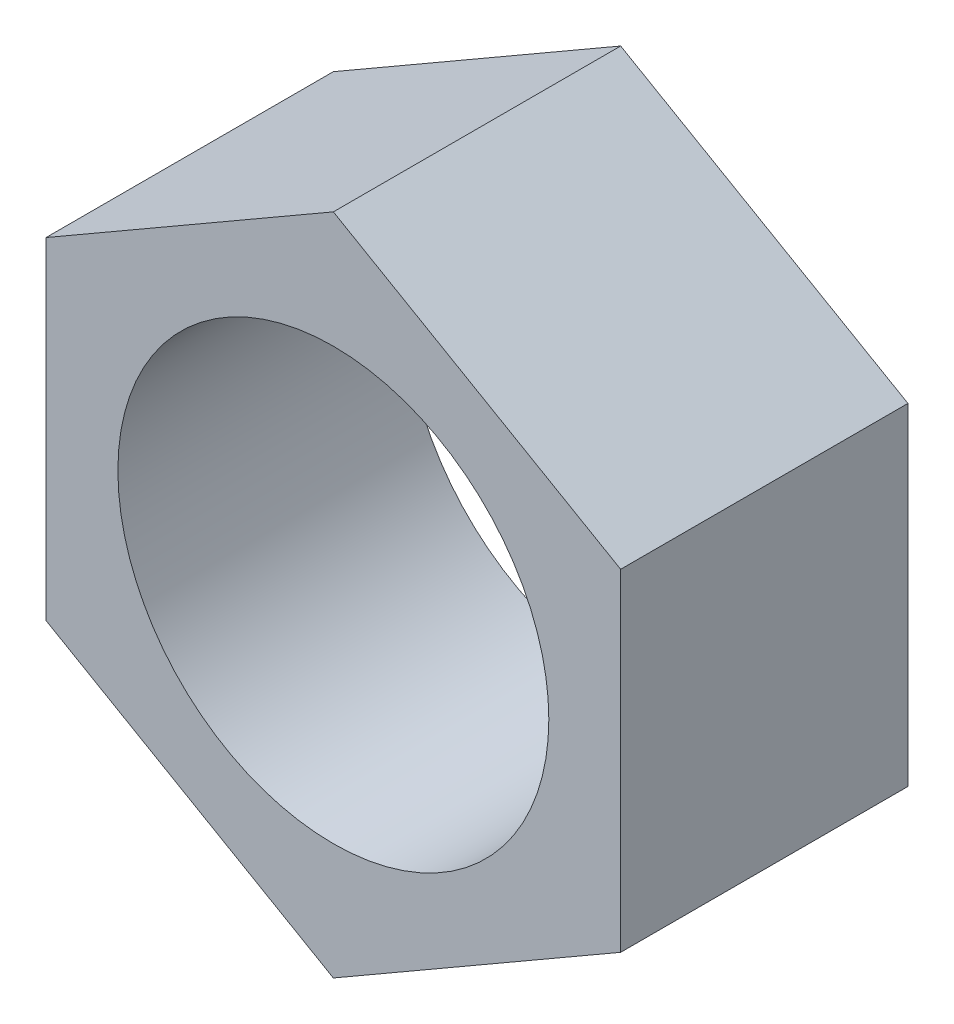
ISO-10303-21;
HEADER;
FILE_DESCRIPTION(('STEP AP214'),'2;1');
FILE_NAME('part.step','',(''),(''),'','','');
FILE_SCHEMA(('AUTOMOTIVE_DESIGN { 1 0 10303 214 1 1 1 1 }'));
ENDSEC;
DATA;
#1=APPLICATION_CONTEXT('core data for automotive mechanical design processes');
#2=APPLICATION_PROTOCOL_DEFINITION('international standard','automotive_design',2000,#1);
#3=PRODUCT_CONTEXT('',#1,'mechanical');
#4=PRODUCT('Part','Part','',(#3));
#5=PRODUCT_RELATED_PRODUCT_CATEGORY('part','',(#4));
#6=PRODUCT_DEFINITION_FORMATION('','',#4);
#7=PRODUCT_DEFINITION_CONTEXT('part definition',#1,'design');
#8=PRODUCT_DEFINITION('design','',#6,#7);
#9=PRODUCT_DEFINITION_SHAPE('','',#8);
#10=(LENGTH_UNIT() NAMED_UNIT(*) SI_UNIT(.MILLI.,.METRE.));
#11=(NAMED_UNIT(*) PLANE_ANGLE_UNIT() SI_UNIT($,.RADIAN.));
#12=(NAMED_UNIT(*) SI_UNIT($,.STERADIAN.) SOLID_ANGLE_UNIT());
#13=UNCERTAINTY_MEASURE_WITH_UNIT(LENGTH_MEASURE(1.E-05),#10,'distance_accuracy_value','');
#14=(GEOMETRIC_REPRESENTATION_CONTEXT(3) GLOBAL_UNCERTAINTY_ASSIGNED_CONTEXT((#13)) GLOBAL_UNIT_ASSIGNED_CONTEXT((#10,
#11,#12)) REPRESENTATION_CONTEXT('',''));
#15=CARTESIAN_POINT('',(0.,0.,0.));
#16=DIRECTION('',(0.,0.,1.));
#17=DIRECTION('',(1.,0.,0.));
#18=AXIS2_PLACEMENT_3D('',#15,#16,#17);
#19=CARTESIAN_POINT('',(9.99999999999999,1.05162021911601E-13,10.));
#20=DIRECTION('',(-1.,0.,0.));
#21=DIRECTION('',(0.,-1.,0.));
#22=AXIS2_PLACEMENT_3D('',#19,#20,#21);
#23=PLANE('',#22);
#24=DIRECTION('',(0.,1.,0.));
#25=VECTOR('',#24,1.);
#26=CARTESIAN_POINT('',(9.99999999999999,1.05162021911601E-13,0.));
#27=LINE('',#26,#25);
#28=CARTESIAN_POINT('',(10.0000000000001,-5.77350269189617,0.));
#29=VERTEX_POINT('',#28);
#30=CARTESIAN_POINT('',(9.99999999999993,5.77350269189638,0.));
#31=VERTEX_POINT('',#30);
#32=EDGE_CURVE('E131',#29,#31,#27,.T.);
#33=ORIENTED_EDGE('',*,*,#32,.T.);
#34=DIRECTION('',(0.,0.,-1.));
#35=VECTOR('',#34,1.);
#36=CARTESIAN_POINT('',(9.99999999999993,5.77350269189638,10.));
#37=LINE('',#36,#35);
#38=CARTESIAN_POINT('',(9.99999999999993,5.77350269189638,10.));
#39=VERTEX_POINT('',#38);
#40=EDGE_CURVE('E11',#39,#31,#37,.T.);
#41=ORIENTED_EDGE('',*,*,#40,.F.);
#42=DIRECTION('',(0.,1.,0.));
#43=VECTOR('',#42,1.);
#44=CARTESIAN_POINT('',(9.99999999999999,1.05162021911601E-13,10.));
#45=LINE('',#44,#43);
#46=CARTESIAN_POINT('',(10.0000000000001,-5.77350269189617,10.));
#47=VERTEX_POINT('',#46);
#48=EDGE_CURVE('E154',#47,#39,#45,.T.);
#49=ORIENTED_EDGE('',*,*,#48,.F.);
#50=DIRECTION('',(0.,0.,-1.));
#51=VECTOR('',#50,1.);
#52=CARTESIAN_POINT('',(10.0000000000001,-5.77350269189617,10.));
#53=LINE('',#52,#51);
#54=EDGE_CURVE('E124',#47,#29,#53,.T.);
#55=ORIENTED_EDGE('',*,*,#54,.T.);
#56=EDGE_LOOP('',(#33,#41,#49,#55));
#57=FACE_BOUND('',#56,.T.);
#58=ADVANCED_FACE('F43',(#57),#23,.F.);
#59=CARTESIAN_POINT('',(4.99999999999997,8.66025403784445,10.));
#60=DIRECTION('',(-0.499999999999995,-0.866025403784442,0.));
#61=DIRECTION('',(0.866025403784442,-0.499999999999995,0.));
#62=AXIS2_PLACEMENT_3D('',#59,#60,#61);
#63=PLANE('',#62);
#64=DIRECTION('',(-0.866025403784442,0.499999999999995,0.));
#65=VECTOR('',#64,1.);
#66=CARTESIAN_POINT('',(4.99999999999997,8.66025403784445,0.));
#67=LINE('',#66,#65);
#68=CARTESIAN_POINT('',(0.,11.5470053837925,0.));
#69=VERTEX_POINT('',#68);
#70=EDGE_CURVE('E134',#31,#69,#67,.T.);
#71=ORIENTED_EDGE('',*,*,#70,.T.);
#72=DIRECTION('',(0.,0.,-1.));
#73=VECTOR('',#72,1.);
#74=CARTESIAN_POINT('',(0.,11.5470053837925,10.));
#75=LINE('',#74,#73);
#76=CARTESIAN_POINT('',(0.,11.5470053837925,10.));
#77=VERTEX_POINT('',#76);
#78=EDGE_CURVE('E52',#77,#69,#75,.T.);
#79=ORIENTED_EDGE('',*,*,#78,.F.);
#80=DIRECTION('',(-0.866025403784442,0.499999999999995,0.));
#81=VECTOR('',#80,1.);
#82=CARTESIAN_POINT('',(4.99999999999997,8.66025403784445,10.));
#83=LINE('',#82,#81);
#84=EDGE_CURVE('E97',#39,#77,#83,.T.);
#85=ORIENTED_EDGE('',*,*,#84,.F.);
#86=ORIENTED_EDGE('',*,*,#40,.T.);
#87=EDGE_LOOP('',(#71,#79,#85,#86));
#88=FACE_BOUND('',#87,.T.);
#89=ADVANCED_FACE('F168',(#88),#63,.F.);
#90=CARTESIAN_POINT('',(-5.00000000000001,8.66025403784438,10.));
#91=DIRECTION('',(0.500000000000001,-0.866025403784438,0.));
#92=DIRECTION('',(0.866025403784438,0.500000000000001,0.));
#93=AXIS2_PLACEMENT_3D('',#90,#91,#92);
#94=PLANE('',#93);
#95=DIRECTION('',(-0.866025403784438,-0.500000000000001,0.));
#96=VECTOR('',#95,1.);
#97=CARTESIAN_POINT('',(-5.00000000000001,8.66025403784438,0.));
#98=LINE('',#97,#96);
#99=CARTESIAN_POINT('',(-10.,5.77350269189624,0.));
#100=VERTEX_POINT('',#99);
#101=EDGE_CURVE('E136',#69,#100,#98,.T.);
#102=ORIENTED_EDGE('',*,*,#101,.T.);
#103=DIRECTION('',(0.,0.,-1.));
#104=VECTOR('',#103,1.);
#105=CARTESIAN_POINT('',(-10.,5.77350269189624,10.));
#106=LINE('',#105,#104);
#107=CARTESIAN_POINT('',(-10.,5.77350269189624,10.));
#108=VERTEX_POINT('',#107);
#109=EDGE_CURVE('E119',#108,#100,#106,.T.);
#110=ORIENTED_EDGE('',*,*,#109,.F.);
#111=DIRECTION('',(-0.866025403784438,-0.500000000000001,0.));
#112=VECTOR('',#111,1.);
#113=CARTESIAN_POINT('',(-5.00000000000001,8.66025403784438,10.));
#114=LINE('',#113,#112);
#115=EDGE_CURVE('E110',#77,#108,#114,.T.);
#116=ORIENTED_EDGE('',*,*,#115,.F.);
#117=ORIENTED_EDGE('',*,*,#78,.T.);
#118=EDGE_LOOP('',(#102,#110,#116,#117));
#119=FACE_BOUND('',#118,.T.);
#120=ADVANCED_FACE('F147',(#119),#94,.F.);
#121=CARTESIAN_POINT('',(-10.,0.,10.));
#122=DIRECTION('',(1.,0.,0.));
#123=DIRECTION('',(0.,1.,0.));
#124=AXIS2_PLACEMENT_3D('',#121,#122,#123);
#125=PLANE('',#124);
#126=DIRECTION('',(0.,-1.,0.));
#127=VECTOR('',#126,1.);
#128=CARTESIAN_POINT('',(-10.,0.,0.));
#129=LINE('',#128,#127);
#130=CARTESIAN_POINT('',(-9.99999999999998,-5.7735026918963,0.));
#131=VERTEX_POINT('',#130);
#132=EDGE_CURVE('E118',#100,#131,#129,.T.);
#133=ORIENTED_EDGE('',*,*,#132,.T.);
#134=DIRECTION('',(0.,0.,-1.));
#135=VECTOR('',#134,1.);
#136=CARTESIAN_POINT('',(-9.99999999999998,-5.7735026918963,10.));
#137=LINE('',#136,#135);
#138=CARTESIAN_POINT('',(-9.99999999999998,-5.7735026918963,10.));
#139=VERTEX_POINT('',#138);
#140=EDGE_CURVE('E115',#139,#131,#137,.T.);
#141=ORIENTED_EDGE('',*,*,#140,.F.);
#142=DIRECTION('',(0.,-1.,0.));
#143=VECTOR('',#142,1.);
#144=CARTESIAN_POINT('',(-10.,0.,10.));
#145=LINE('',#144,#143);
#146=EDGE_CURVE('E104',#108,#139,#145,.T.);
#147=ORIENTED_EDGE('',*,*,#146,.F.);
#148=ORIENTED_EDGE('',*,*,#109,.T.);
#149=EDGE_LOOP('',(#133,#141,#147,#148));
#150=FACE_BOUND('',#149,.T.);
#151=ADVANCED_FACE('F116',(#150),#125,.F.);
#152=CARTESIAN_POINT('',(-4.99999999999995,-8.66025403784441,10.));
#153=DIRECTION('',(0.499999999999995,0.866025403784442,0.));
#154=DIRECTION('',(-0.866025403784442,0.499999999999995,0.));
#155=AXIS2_PLACEMENT_3D('',#152,#153,#154);
#156=PLANE('',#155);
#157=DIRECTION('',(0.866025403784442,-0.499999999999995,0.));
#158=VECTOR('',#157,1.);
#159=CARTESIAN_POINT('',(-4.99999999999995,-8.66025403784441,0.));
#160=LINE('',#159,#158);
#161=CARTESIAN_POINT('',(0.,-11.5470053837925,0.));
#162=VERTEX_POINT('',#161);
#163=EDGE_CURVE('E83',#131,#162,#160,.T.);
#164=ORIENTED_EDGE('',*,*,#163,.T.);
#165=DIRECTION('',(0.,0.,-1.));
#166=VECTOR('',#165,1.);
#167=CARTESIAN_POINT('',(0.,-11.5470053837925,10.));
#168=LINE('',#167,#166);
#169=CARTESIAN_POINT('',(0.,-11.5470053837925,10.));
#170=VERTEX_POINT('',#169);
#171=EDGE_CURVE('E120',#170,#162,#168,.T.);
#172=ORIENTED_EDGE('',*,*,#171,.F.);
#173=DIRECTION('',(0.866025403784442,-0.499999999999995,0.));
#174=VECTOR('',#173,1.);
#175=CARTESIAN_POINT('',(-4.99999999999995,-8.66025403784441,10.));
#176=LINE('',#175,#174);
#177=EDGE_CURVE('E108',#139,#170,#176,.T.);
#178=ORIENTED_EDGE('',*,*,#177,.F.);
#179=ORIENTED_EDGE('',*,*,#140,.T.);
#180=EDGE_LOOP('',(#164,#172,#178,#179));
#181=FACE_BOUND('',#180,.T.);
#182=ADVANCED_FACE('F122',(#181),#156,.F.);
#183=CARTESIAN_POINT('',(0.,0.,10.));
#184=DIRECTION('',(0.,0.,-1.));
#185=DIRECTION('',(-1.,0.,0.));
#186=AXIS2_PLACEMENT_3D('',#183,#184,#185);
#187=CYLINDRICAL_SURFACE('',#186,7.5);
#188=CARTESIAN_POINT('',(0.,0.,10.));
#189=DIRECTION('',(0.,0.,1.));
#190=DIRECTION('',(1.,0.,0.));
#191=AXIS2_PLACEMENT_3D('',#188,#189,#190);
#192=CIRCLE('',#191,7.5);
#193=CARTESIAN_POINT('',(7.5,0.,10.));
#194=VERTEX_POINT('',#193);
#195=EDGE_CURVE('E141',#194,#194,#192,.T.);
#196=ORIENTED_EDGE('',*,*,#195,.T.);
#197=EDGE_LOOP('',(#196));
#198=FACE_BOUND('',#197,.T.);
#199=CARTESIAN_POINT('',(0.,0.,0.));
#200=DIRECTION('',(0.,0.,1.));
#201=DIRECTION('',(1.,0.,0.));
#202=AXIS2_PLACEMENT_3D('',#199,#200,#201);
#203=CIRCLE('',#202,7.5);
#204=CARTESIAN_POINT('',(7.5,0.,0.));
#205=VERTEX_POINT('',#204);
#206=EDGE_CURVE('E128',#205,#205,#203,.T.);
#207=ORIENTED_EDGE('',*,*,#206,.F.);
#208=EDGE_LOOP('',(#207));
#209=FACE_BOUND('',#208,.T.);
#210=ADVANCED_FACE('F45',(#198,#209),#187,.F.);
#211=CARTESIAN_POINT('',(5.00000000000007,-8.66025403784434,10.));
#212=DIRECTION('',(-0.500000000000007,0.866025403784435,0.));
#213=DIRECTION('',(-0.866025403784435,-0.500000000000007,0.));
#214=AXIS2_PLACEMENT_3D('',#211,#212,#213);
#215=PLANE('',#214);
#216=DIRECTION('',(0.866025403784435,0.500000000000007,0.));
#217=VECTOR('',#216,1.);
#218=CARTESIAN_POINT('',(5.00000000000007,-8.66025403784434,0.));
#219=LINE('',#218,#217);
#220=EDGE_CURVE('E89',#162,#29,#219,.T.);
#221=ORIENTED_EDGE('',*,*,#220,.T.);
#222=ORIENTED_EDGE('',*,*,#54,.F.);
#223=DIRECTION('',(0.866025403784435,0.500000000000007,0.));
#224=VECTOR('',#223,1.);
#225=CARTESIAN_POINT('',(5.00000000000007,-8.66025403784434,10.));
#226=LINE('',#225,#224);
#227=EDGE_CURVE('E60',#170,#47,#226,.T.);
#228=ORIENTED_EDGE('',*,*,#227,.F.);
#229=ORIENTED_EDGE('',*,*,#171,.T.);
#230=EDGE_LOOP('',(#221,#222,#228,#229));
#231=FACE_BOUND('',#230,.T.);
#232=ADVANCED_FACE('F155',(#231),#215,.F.);
#233=CARTESIAN_POINT('',(0.,0.,10.));
#234=DIRECTION('',(0.,0.,1.));
#235=DIRECTION('',(1.,0.,0.));
#236=AXIS2_PLACEMENT_3D('',#233,#234,#235);
#237=PLANE('',#236);
#238=ORIENTED_EDGE('',*,*,#195,.F.);
#239=EDGE_LOOP('',(#238));
#240=FACE_BOUND('',#239,.T.);
#241=ORIENTED_EDGE('',*,*,#48,.T.);
#242=ORIENTED_EDGE('',*,*,#84,.T.);
#243=ORIENTED_EDGE('',*,*,#115,.T.);
#244=ORIENTED_EDGE('',*,*,#146,.T.);
#245=ORIENTED_EDGE('',*,*,#177,.T.);
#246=ORIENTED_EDGE('',*,*,#227,.T.);
#247=EDGE_LOOP('',(#241,#242,#243,#244,#245,#246));
#248=FACE_BOUND('',#247,.T.);
#249=ADVANCED_FACE('F106',(#240,#248),#237,.T.);
#250=CARTESIAN_POINT('',(0.,0.,0.));
#251=DIRECTION('',(0.,0.,1.));
#252=DIRECTION('',(1.,0.,0.));
#253=AXIS2_PLACEMENT_3D('',#250,#251,#252);
#254=PLANE('',#253);
#255=ORIENTED_EDGE('',*,*,#206,.T.);
#256=EDGE_LOOP('',(#255));
#257=FACE_BOUND('',#256,.T.);
#258=ORIENTED_EDGE('',*,*,#32,.F.);
#259=ORIENTED_EDGE('',*,*,#220,.F.);
#260=ORIENTED_EDGE('',*,*,#163,.F.);
#261=ORIENTED_EDGE('',*,*,#132,.F.);
#262=ORIENTED_EDGE('',*,*,#101,.F.);
#263=ORIENTED_EDGE('',*,*,#70,.F.);
#264=EDGE_LOOP('',(#258,#259,#260,#261,#262,#263));
#265=FACE_BOUND('',#264,.T.);
#266=ADVANCED_FACE('F150',(#257,#265),#254,.F.);
#267=CLOSED_SHELL('',(#58,#89,#120,#151,#182,#210,#232,#249,#266));
#268=MANIFOLD_SOLID_BREP('B2',#267);
#269=ADVANCED_BREP_SHAPE_REPRESENTATION('',(#18,#268),#14);
#270=SHAPE_DEFINITION_REPRESENTATION(#9,#269);
ENDSEC;
END-ISO-10303-21;
